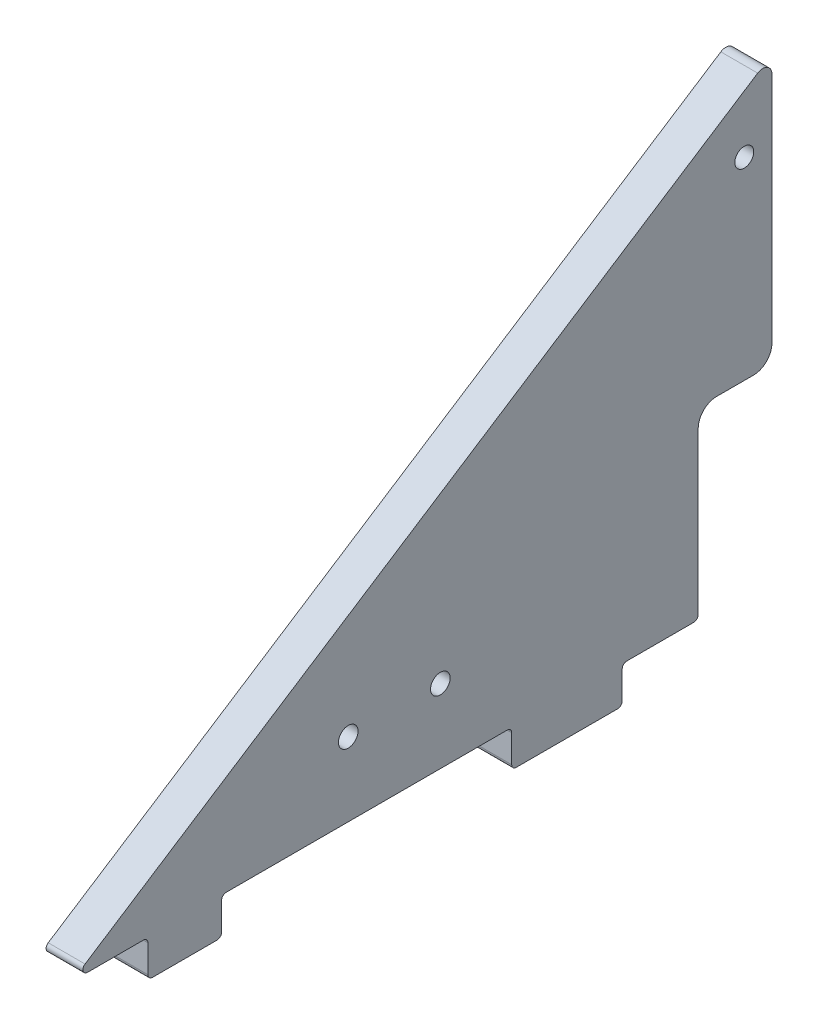
ISO-10303-21;
HEADER;
FILE_DESCRIPTION(('STEP AP214'),'2;1');
FILE_NAME('part.step','',(''),(''),'','','');
FILE_SCHEMA(('AUTOMOTIVE_DESIGN { 1 0 10303 214 1 1 1 1 }'));
ENDSEC;
DATA;
#1=APPLICATION_CONTEXT('core data for automotive mechanical design processes');
#2=APPLICATION_PROTOCOL_DEFINITION('international standard','automotive_design',2000,#1);
#3=PRODUCT_CONTEXT('',#1,'mechanical');
#4=PRODUCT('Part','Part','',(#3));
#5=PRODUCT_RELATED_PRODUCT_CATEGORY('part','',(#4));
#6=PRODUCT_DEFINITION_FORMATION('','',#4);
#7=PRODUCT_DEFINITION_CONTEXT('part definition',#1,'design');
#8=PRODUCT_DEFINITION('design','',#6,#7);
#9=PRODUCT_DEFINITION_SHAPE('','',#8);
#10=(LENGTH_UNIT() NAMED_UNIT(*) SI_UNIT(.MILLI.,.METRE.));
#11=(NAMED_UNIT(*) PLANE_ANGLE_UNIT() SI_UNIT($,.RADIAN.));
#12=(NAMED_UNIT(*) SI_UNIT($,.STERADIAN.) SOLID_ANGLE_UNIT());
#13=UNCERTAINTY_MEASURE_WITH_UNIT(LENGTH_MEASURE(1.E-05),#10,'distance_accuracy_value','');
#14=(GEOMETRIC_REPRESENTATION_CONTEXT(3) GLOBAL_UNCERTAINTY_ASSIGNED_CONTEXT((#13)) GLOBAL_UNIT_ASSIGNED_CONTEXT((#10,
#11,#12)) REPRESENTATION_CONTEXT('',''));
#15=CARTESIAN_POINT('',(0.,0.,0.));
#16=DIRECTION('',(0.,0.,1.));
#17=DIRECTION('',(1.,0.,0.));
#18=AXIS2_PLACEMENT_3D('',#15,#16,#17);
#19=CARTESIAN_POINT('',(6.35,0.,0.));
#20=DIRECTION('',(0.,0.,-1.));
#21=DIRECTION('',(0.,1.,0.));
#22=AXIS2_PLACEMENT_3D('',#19,#20,#21);
#23=PLANE('',#22);
#24=DIRECTION('',(0.,-1.,0.));
#25=VECTOR('',#24,1.);
#26=CARTESIAN_POINT('',(-6.35,0.,0.));
#27=LINE('',#26,#25);
#28=CARTESIAN_POINT('',(-6.35,57.15,0.));
#29=VERTEX_POINT('',#28);
#30=CARTESIAN_POINT('',(-6.35,1.5875,0.));
#31=VERTEX_POINT('',#30);
#32=EDGE_CURVE('E231',#29,#31,#27,.T.);
#33=ORIENTED_EDGE('',*,*,#32,.F.);
#34=DIRECTION('',(-1.,0.,0.));
#35=VECTOR('',#34,1.);
#36=CARTESIAN_POINT('',(6.35,57.15,0.));
#37=LINE('',#36,#35);
#38=CARTESIAN_POINT('',(6.35,57.15,0.));
#39=VERTEX_POINT('',#38);
#40=EDGE_CURVE('E62',#29,#39,#37,.F.);
#41=ORIENTED_EDGE('',*,*,#40,.T.);
#42=DIRECTION('',(0.,-1.,0.));
#43=VECTOR('',#42,1.);
#44=CARTESIAN_POINT('',(6.35,0.,0.));
#45=LINE('',#44,#43);
#46=CARTESIAN_POINT('',(6.35,1.5875,0.));
#47=VERTEX_POINT('',#46);
#48=EDGE_CURVE('E396',#39,#47,#45,.T.);
#49=ORIENTED_EDGE('',*,*,#48,.T.);
#50=DIRECTION('',(-1.,0.,0.));
#51=VECTOR('',#50,1.);
#52=CARTESIAN_POINT('',(6.35,1.5875,0.));
#53=LINE('',#52,#51);
#54=EDGE_CURVE('E330',#47,#31,#53,.T.);
#55=ORIENTED_EDGE('',*,*,#54,.T.);
#56=EDGE_LOOP('',(#33,#41,#49,#55));
#57=FACE_BOUND('',#56,.T.);
#58=ADVANCED_FACE('F47',(#57),#23,.T.);
#59=CARTESIAN_POINT('',(6.35,98.4714634146341,63.7168292682927));
#60=DIRECTION('',(0.,0.839570157152151,0.543251278157274));
#61=DIRECTION('',(0.,-0.543251278157274,0.839570157152151));
#62=AXIS2_PLACEMENT_3D('',#59,#60,#61);
#63=PLANE('',#62);
#64=DIRECTION('',(0.,0.543251278157274,-0.839570157152151));
#65=VECTOR('',#64,1.);
#66=CARTESIAN_POINT('',(-6.35,98.4714634146341,63.7168292682927));
#67=LINE('',#66,#65);
#68=CARTESIAN_POINT('',(-6.35,2.920317624479,211.386781853078));
#69=VERTEX_POINT('',#68);
#70=CARTESIAN_POINT('',(-6.35,152.964820535903,-20.5001771918507));
#71=VERTEX_POINT('',#70);
#72=EDGE_CURVE('E219',#69,#71,#67,.T.);
#73=ORIENTED_EDGE('',*,*,#72,.F.);
#74=DIRECTION('',(-1.,0.,0.));
#75=VECTOR('',#74,1.);
#76=CARTESIAN_POINT('',(6.35,2.92031762447902,211.386781853078));
#77=LINE('',#76,#75);
#78=CARTESIAN_POINT('',(6.35,2.920317624479,211.386781853078));
#79=VERTEX_POINT('',#78);
#80=EDGE_CURVE('E275',#69,#79,#77,.F.);
#81=ORIENTED_EDGE('',*,*,#80,.T.);
#82=DIRECTION('',(0.,0.543251278157274,-0.839570157152151));
#83=VECTOR('',#82,1.);
#84=CARTESIAN_POINT('',(6.35,98.4714634146341,63.7168292682927));
#85=LINE('',#84,#83);
#86=CARTESIAN_POINT('',(6.35,152.964820535903,-20.5001771918507));
#87=VERTEX_POINT('',#86);
#88=EDGE_CURVE('E243',#79,#87,#85,.T.);
#89=ORIENTED_EDGE('',*,*,#88,.T.);
#90=DIRECTION('',(-1.,0.,0.));
#91=VECTOR('',#90,1.);
#92=CARTESIAN_POINT('',(6.35,152.964820535903,-20.5001771918507));
#93=LINE('',#92,#91);
#94=EDGE_CURVE('E238',#87,#71,#93,.T.);
#95=ORIENTED_EDGE('',*,*,#94,.T.);
#96=EDGE_LOOP('',(#73,#81,#89,#95));
#97=FACE_BOUND('',#96,.T.);
#98=ADVANCED_FACE('F241',(#97),#63,.T.);
#99=CARTESIAN_POINT('',(6.35,0.,0.));
#100=DIRECTION('',(0.,-1.,0.));
#101=DIRECTION('',(0.,0.,-1.));
#102=AXIS2_PLACEMENT_3D('',#99,#100,#101);
#103=PLANE('',#102);
#104=DIRECTION('',(0.,0.,1.));
#105=VECTOR('',#104,1.);
#106=CARTESIAN_POINT('',(6.35,0.,0.));
#107=LINE('',#106,#105);
#108=CARTESIAN_POINT('',(6.35,0.,191.29375));
#109=VERTEX_POINT('',#108);
#110=CARTESIAN_POINT('',(6.35,0.,210.524370449003));
#111=VERTEX_POINT('',#110);
#112=EDGE_CURVE('E251',#109,#111,#107,.T.);
#113=ORIENTED_EDGE('',*,*,#112,.T.);
#114=DIRECTION('',(-1.,0.,0.));
#115=VECTOR('',#114,1.);
#116=CARTESIAN_POINT('',(6.35,0.,210.524370449003));
#117=LINE('',#116,#115);
#118=CARTESIAN_POINT('',(-6.35,0.,210.524370449003));
#119=VERTEX_POINT('',#118);
#120=EDGE_CURVE('E261',#111,#119,#117,.T.);
#121=ORIENTED_EDGE('',*,*,#120,.T.);
#122=DIRECTION('',(0.,0.,1.));
#123=VECTOR('',#122,1.);
#124=CARTESIAN_POINT('',(-6.35,0.,0.));
#125=LINE('',#124,#123);
#126=CARTESIAN_POINT('',(-6.35,0.,191.29375));
#127=VERTEX_POINT('',#126);
#128=EDGE_CURVE('E230',#127,#119,#125,.T.);
#129=ORIENTED_EDGE('',*,*,#128,.F.);
#130=DIRECTION('',(-1.,0.,0.));
#131=VECTOR('',#130,1.);
#132=CARTESIAN_POINT('',(6.35,0.,191.29375));
#133=LINE('',#132,#131);
#134=EDGE_CURVE('E259',#127,#109,#133,.F.);
#135=ORIENTED_EDGE('',*,*,#134,.T.);
#136=EDGE_LOOP('',(#113,#121,#129,#135));
#137=FACE_BOUND('',#136,.T.);
#138=ADVANCED_FACE('F443',(#137),#103,.T.);
#139=CARTESIAN_POINT('',(6.35,0.,189.70625));
#140=DIRECTION('',(0.,0.,-1.));
#141=DIRECTION('',(-1.,0.,0.));
#142=AXIS2_PLACEMENT_3D('',#139,#140,#141);
#143=PLANE('',#142);
#144=DIRECTION('',(0.,-1.,0.));
#145=VECTOR('',#144,1.);
#146=CARTESIAN_POINT('',(6.35,0.,189.70625));
#147=LINE('',#146,#145);
#148=CARTESIAN_POINT('',(6.35,-1.58750000000002,189.70625));
#149=VERTEX_POINT('',#148);
#150=CARTESIAN_POINT('',(6.35,-11.1125,189.70625));
#151=VERTEX_POINT('',#150);
#152=EDGE_CURVE('E400',#149,#151,#147,.T.);
#153=ORIENTED_EDGE('',*,*,#152,.F.);
#154=DIRECTION('',(-1.,0.,0.));
#155=VECTOR('',#154,1.);
#156=CARTESIAN_POINT('',(6.35,-1.58750000000002,189.70625));
#157=LINE('',#156,#155);
#158=CARTESIAN_POINT('',(-6.35,-1.58750000000002,189.70625));
#159=VERTEX_POINT('',#158);
#160=EDGE_CURVE('E317',#149,#159,#157,.T.);
#161=ORIENTED_EDGE('',*,*,#160,.T.);
#162=DIRECTION('',(0.,-1.,0.));
#163=VECTOR('',#162,1.);
#164=CARTESIAN_POINT('',(-6.35,0.,189.70625));
#165=LINE('',#164,#163);
#166=CARTESIAN_POINT('',(-6.35,-11.1125,189.70625));
#167=VERTEX_POINT('',#166);
#168=EDGE_CURVE('E422',#159,#167,#165,.T.);
#169=ORIENTED_EDGE('',*,*,#168,.T.);
#170=DIRECTION('',(-1.,0.,0.));
#171=VECTOR('',#170,1.);
#172=CARTESIAN_POINT('',(6.35,-11.1125,189.70625));
#173=LINE('',#172,#171);
#174=EDGE_CURVE('E315',#167,#151,#173,.F.);
#175=ORIENTED_EDGE('',*,*,#174,.T.);
#176=EDGE_LOOP('',(#153,#161,#169,#175));
#177=FACE_BOUND('',#176,.T.);
#178=ADVANCED_FACE('F454',(#177),#143,.F.);
#179=CARTESIAN_POINT('',(6.35,-12.7,0.));
#180=DIRECTION('',(0.,-1.,0.));
#181=DIRECTION('',(0.,0.,-1.));
#182=AXIS2_PLACEMENT_3D('',#179,#180,#181);
#183=PLANE('',#182);
#184=DIRECTION('',(0.,0.,1.));
#185=VECTOR('',#184,1.);
#186=CARTESIAN_POINT('',(-6.35,-12.7,0.));
#187=LINE('',#186,#185);
#188=CARTESIAN_POINT('',(-6.35,-12.7,165.89375));
#189=VERTEX_POINT('',#188);
#190=CARTESIAN_POINT('',(-6.35,-12.7,188.11875));
#191=VERTEX_POINT('',#190);
#192=EDGE_CURVE('E425',#189,#191,#187,.T.);
#193=ORIENTED_EDGE('',*,*,#192,.F.);
#194=DIRECTION('',(-1.,0.,0.));
#195=VECTOR('',#194,1.);
#196=CARTESIAN_POINT('',(6.35,-12.7,165.89375));
#197=LINE('',#196,#195);
#198=CARTESIAN_POINT('',(6.35,-12.7,165.89375));
#199=VERTEX_POINT('',#198);
#200=EDGE_CURVE('E323',#189,#199,#197,.F.);
#201=ORIENTED_EDGE('',*,*,#200,.T.);
#202=DIRECTION('',(0.,0.,1.));
#203=VECTOR('',#202,1.);
#204=CARTESIAN_POINT('',(6.35,-12.7,0.));
#205=LINE('',#204,#203);
#206=CARTESIAN_POINT('',(6.35,-12.7,188.11875));
#207=VERTEX_POINT('',#206);
#208=EDGE_CURVE('E403',#199,#207,#205,.T.);
#209=ORIENTED_EDGE('',*,*,#208,.T.);
#210=DIRECTION('',(-1.,0.,0.));
#211=VECTOR('',#210,1.);
#212=CARTESIAN_POINT('',(-6.35,-12.7,188.11875));
#213=LINE('',#212,#211);
#214=EDGE_CURVE('E320',#207,#191,#213,.T.);
#215=ORIENTED_EDGE('',*,*,#214,.T.);
#216=EDGE_LOOP('',(#193,#201,#209,#215));
#217=FACE_BOUND('',#216,.T.);
#218=ADVANCED_FACE('F463',(#217),#183,.T.);
#219=CARTESIAN_POINT('',(6.35,0.,164.30625));
#220=DIRECTION('',(0.,0.,-1.));
#221=DIRECTION('',(-1.,0.,0.));
#222=AXIS2_PLACEMENT_3D('',#219,#220,#221);
#223=PLANE('',#222);
#224=DIRECTION('',(0.,-1.,0.));
#225=VECTOR('',#224,1.);
#226=CARTESIAN_POINT('',(-6.35,0.,164.30625));
#227=LINE('',#226,#225);
#228=CARTESIAN_POINT('',(-6.35,-1.58750000000002,164.30625));
#229=VERTEX_POINT('',#228);
#230=CARTESIAN_POINT('',(-6.35,-11.1125,164.30625));
#231=VERTEX_POINT('',#230);
#232=EDGE_CURVE('E421',#229,#231,#227,.T.);
#233=ORIENTED_EDGE('',*,*,#232,.F.);
#234=DIRECTION('',(-1.,0.,0.));
#235=VECTOR('',#234,1.);
#236=CARTESIAN_POINT('',(6.35,-1.58750000000002,164.30625));
#237=LINE('',#236,#235);
#238=CARTESIAN_POINT('',(6.35,-1.58750000000002,164.30625));
#239=VERTEX_POINT('',#238);
#240=EDGE_CURVE('E313',#229,#239,#237,.F.);
#241=ORIENTED_EDGE('',*,*,#240,.T.);
#242=DIRECTION('',(0.,-1.,0.));
#243=VECTOR('',#242,1.);
#244=CARTESIAN_POINT('',(6.35,0.,164.30625));
#245=LINE('',#244,#243);
#246=CARTESIAN_POINT('',(6.35,-11.1125,164.30625));
#247=VERTEX_POINT('',#246);
#248=EDGE_CURVE('E406',#239,#247,#245,.T.);
#249=ORIENTED_EDGE('',*,*,#248,.T.);
#250=DIRECTION('',(-1.,0.,0.));
#251=VECTOR('',#250,1.);
#252=CARTESIAN_POINT('',(6.35,-11.1125,164.30625));
#253=LINE('',#252,#251);
#254=EDGE_CURVE('E310',#247,#231,#253,.T.);
#255=ORIENTED_EDGE('',*,*,#254,.T.);
#256=EDGE_LOOP('',(#233,#241,#249,#255));
#257=FACE_BOUND('',#256,.T.);
#258=ADVANCED_FACE('F472',(#257),#223,.T.);
#259=CARTESIAN_POINT('',(-6.35,0.,65.88125));
#260=VERTEX_POINT('',#259);
#261=CARTESIAN_POINT('',(-6.35,0.,162.71875));
#262=VERTEX_POINT('',#261);
#263=EDGE_CURVE('E417',#260,#262,#125,.T.);
#264=ORIENTED_EDGE('',*,*,#263,.F.);
#265=DIRECTION('',(-1.,0.,0.));
#266=VECTOR('',#265,1.);
#267=CARTESIAN_POINT('',(6.35,0.,65.88125));
#268=LINE('',#267,#266);
#269=CARTESIAN_POINT('',(6.35,0.,65.88125));
#270=VERTEX_POINT('',#269);
#271=EDGE_CURVE('E298',#260,#270,#268,.F.);
#272=ORIENTED_EDGE('',*,*,#271,.T.);
#273=CARTESIAN_POINT('',(6.35,0.,162.71875));
#274=VERTEX_POINT('',#273);
#275=EDGE_CURVE('E250',#270,#274,#107,.T.);
#276=ORIENTED_EDGE('',*,*,#275,.T.);
#277=DIRECTION('',(-1.,0.,0.));
#278=VECTOR('',#277,1.);
#279=CARTESIAN_POINT('',(-6.35,0.,162.71875));
#280=LINE('',#279,#278);
#281=EDGE_CURVE('E295',#274,#262,#280,.T.);
#282=ORIENTED_EDGE('',*,*,#281,.T.);
#283=EDGE_LOOP('',(#264,#272,#276,#282));
#284=FACE_BOUND('',#283,.T.);
#285=ADVANCED_FACE('F482',(#284),#103,.T.);
#286=CARTESIAN_POINT('',(6.35,0.,64.29375));
#287=DIRECTION('',(0.,0.,-1.));
#288=DIRECTION('',(-1.,0.,0.));
#289=AXIS2_PLACEMENT_3D('',#286,#287,#288);
#290=PLANE('',#289);
#291=DIRECTION('',(0.,-1.,0.));
#292=VECTOR('',#291,1.);
#293=CARTESIAN_POINT('',(6.35,0.,64.29375));
#294=LINE('',#293,#292);
#295=CARTESIAN_POINT('',(6.35,-1.58750000000001,64.29375));
#296=VERTEX_POINT('',#295);
#297=CARTESIAN_POINT('',(6.35,-11.1125,64.29375));
#298=VERTEX_POINT('',#297);
#299=EDGE_CURVE('E409',#296,#298,#294,.T.);
#300=ORIENTED_EDGE('',*,*,#299,.F.);
#301=DIRECTION('',(-1.,0.,0.));
#302=VECTOR('',#301,1.);
#303=CARTESIAN_POINT('',(6.35,-1.58750000000001,64.29375));
#304=LINE('',#303,#302);
#305=CARTESIAN_POINT('',(-6.35,-1.58750000000001,64.29375));
#306=VERTEX_POINT('',#305);
#307=EDGE_CURVE('E292',#296,#306,#304,.T.);
#308=ORIENTED_EDGE('',*,*,#307,.T.);
#309=DIRECTION('',(0.,-1.,0.));
#310=VECTOR('',#309,1.);
#311=CARTESIAN_POINT('',(-6.35,0.,64.29375));
#312=LINE('',#311,#310);
#313=CARTESIAN_POINT('',(-6.35,-11.1125,64.29375));
#314=VERTEX_POINT('',#313);
#315=EDGE_CURVE('E420',#306,#314,#312,.T.);
#316=ORIENTED_EDGE('',*,*,#315,.T.);
#317=DIRECTION('',(-1.,0.,0.));
#318=VECTOR('',#317,1.);
#319=CARTESIAN_POINT('',(6.35,-11.1125,64.29375));
#320=LINE('',#319,#318);
#321=EDGE_CURVE('E290',#314,#298,#320,.F.);
#322=ORIENTED_EDGE('',*,*,#321,.T.);
#323=EDGE_LOOP('',(#300,#308,#316,#322));
#324=FACE_BOUND('',#323,.T.);
#325=ADVANCED_FACE('F565',(#324),#290,.F.);
#326=CARTESIAN_POINT('',(6.35,-12.7,0.));
#327=DIRECTION('',(0.,-1.,0.));
#328=DIRECTION('',(0.,0.,-1.));
#329=AXIS2_PLACEMENT_3D('',#326,#327,#328);
#330=PLANE('',#329);
#331=DIRECTION('',(0.,0.,1.));
#332=VECTOR('',#331,1.);
#333=CARTESIAN_POINT('',(6.35,-12.7,0.));
#334=LINE('',#333,#332);
#335=CARTESIAN_POINT('',(6.35,-12.7,27.78125));
#336=VERTEX_POINT('',#335);
#337=CARTESIAN_POINT('',(6.35,-12.7,62.70625));
#338=VERTEX_POINT('',#337);
#339=EDGE_CURVE('E412',#336,#338,#334,.T.);
#340=ORIENTED_EDGE('',*,*,#339,.T.);
#341=DIRECTION('',(-1.,0.,0.));
#342=VECTOR('',#341,1.);
#343=CARTESIAN_POINT('',(-6.35,-12.7,62.70625));
#344=LINE('',#343,#342);
#345=CARTESIAN_POINT('',(-6.35,-12.7,62.70625));
#346=VERTEX_POINT('',#345);
#347=EDGE_CURVE('E327',#338,#346,#344,.T.);
#348=ORIENTED_EDGE('',*,*,#347,.T.);
#349=DIRECTION('',(0.,0.,1.));
#350=VECTOR('',#349,1.);
#351=CARTESIAN_POINT('',(-6.35,-12.7,0.));
#352=LINE('',#351,#350);
#353=CARTESIAN_POINT('',(-6.35,-12.7,27.78125));
#354=VERTEX_POINT('',#353);
#355=EDGE_CURVE('E431',#354,#346,#352,.T.);
#356=ORIENTED_EDGE('',*,*,#355,.F.);
#357=DIRECTION('',(-1.,0.,0.));
#358=VECTOR('',#357,1.);
#359=CARTESIAN_POINT('',(6.35,-12.7,27.78125));
#360=LINE('',#359,#358);
#361=EDGE_CURVE('E325',#354,#336,#360,.F.);
#362=ORIENTED_EDGE('',*,*,#361,.T.);
#363=EDGE_LOOP('',(#340,#348,#356,#362));
#364=FACE_BOUND('',#363,.T.);
#365=ADVANCED_FACE('F557',(#364),#330,.T.);
#366=CARTESIAN_POINT('',(6.35,0.,26.19375));
#367=DIRECTION('',(0.,0.,-1.));
#368=DIRECTION('',(-1.,0.,0.));
#369=AXIS2_PLACEMENT_3D('',#366,#367,#368);
#370=PLANE('',#369);
#371=DIRECTION('',(0.,-1.,0.));
#372=VECTOR('',#371,1.);
#373=CARTESIAN_POINT('',(-6.35,0.,26.19375));
#374=LINE('',#373,#372);
#375=CARTESIAN_POINT('',(-6.35,-1.5875,26.19375));
#376=VERTEX_POINT('',#375);
#377=CARTESIAN_POINT('',(-6.35,-11.1125,26.19375));
#378=VERTEX_POINT('',#377);
#379=EDGE_CURVE('E253',#376,#378,#374,.T.);
#380=ORIENTED_EDGE('',*,*,#379,.F.);
#381=DIRECTION('',(-1.,0.,0.));
#382=VECTOR('',#381,1.);
#383=CARTESIAN_POINT('',(6.35,-1.5875,26.19375));
#384=LINE('',#383,#382);
#385=CARTESIAN_POINT('',(6.35,-1.5875,26.19375));
#386=VERTEX_POINT('',#385);
#387=EDGE_CURVE('E308',#376,#386,#384,.F.);
#388=ORIENTED_EDGE('',*,*,#387,.T.);
#389=DIRECTION('',(0.,-1.,0.));
#390=VECTOR('',#389,1.);
#391=CARTESIAN_POINT('',(6.35,0.,26.19375));
#392=LINE('',#391,#390);
#393=CARTESIAN_POINT('',(6.35,-11.1125,26.19375));
#394=VERTEX_POINT('',#393);
#395=EDGE_CURVE('E248',#386,#394,#392,.T.);
#396=ORIENTED_EDGE('',*,*,#395,.T.);
#397=DIRECTION('',(-1.,0.,0.));
#398=VECTOR('',#397,1.);
#399=CARTESIAN_POINT('',(6.35,-11.1125,26.19375));
#400=LINE('',#399,#398);
#401=EDGE_CURVE('E305',#394,#378,#400,.T.);
#402=ORIENTED_EDGE('',*,*,#401,.T.);
#403=EDGE_LOOP('',(#380,#388,#396,#402));
#404=FACE_BOUND('',#403,.T.);
#405=ADVANCED_FACE('F552',(#404),#370,.T.);
#406=CARTESIAN_POINT('',(6.35,0.,1.5875));
#407=VERTEX_POINT('',#406);
#408=CARTESIAN_POINT('',(6.35,0.,24.60625));
#409=VERTEX_POINT('',#408);
#410=EDGE_CURVE('E245',#407,#409,#107,.T.);
#411=ORIENTED_EDGE('',*,*,#410,.T.);
#412=DIRECTION('',(-1.,0.,0.));
#413=VECTOR('',#412,1.);
#414=CARTESIAN_POINT('',(-6.35,0.,24.60625));
#415=LINE('',#414,#413);
#416=CARTESIAN_POINT('',(-6.35,0.,24.60625));
#417=VERTEX_POINT('',#416);
#418=EDGE_CURVE('E302',#409,#417,#415,.T.);
#419=ORIENTED_EDGE('',*,*,#418,.T.);
#420=CARTESIAN_POINT('',(-6.35,0.,1.5875));
#421=VERTEX_POINT('',#420);
#422=EDGE_CURVE('E398',#421,#417,#125,.T.);
#423=ORIENTED_EDGE('',*,*,#422,.F.);
#424=DIRECTION('',(-1.,0.,0.));
#425=VECTOR('',#424,1.);
#426=CARTESIAN_POINT('',(6.35,0.,1.5875));
#427=LINE('',#426,#425);
#428=EDGE_CURVE('E300',#421,#407,#427,.F.);
#429=ORIENTED_EDGE('',*,*,#428,.T.);
#430=EDGE_LOOP('',(#411,#419,#423,#429));
#431=FACE_BOUND('',#430,.T.);
#432=ADVANCED_FACE('F549',(#431),#103,.T.);
#433=CARTESIAN_POINT('',(6.35,0.,0.));
#434=DIRECTION('',(1.,0.,0.));
#435=DIRECTION('',(0.,0.,-1.));
#436=AXIS2_PLACEMENT_3D('',#433,#434,#435);
#437=PLANE('',#436);
#438=CARTESIAN_POINT('',(6.35,130.175,-15.875));
#439=DIRECTION('',(1.,0.,0.));
#440=DIRECTION('',(0.,0.,-1.));
#441=AXIS2_PLACEMENT_3D('',#438,#439,#440);
#442=CIRCLE('',#441,3.26389999999999);
#443=CARTESIAN_POINT('',(6.35,130.175,-19.1389));
#444=VERTEX_POINT('',#443);
#445=EDGE_CURVE('E827',#444,#444,#442,.T.);
#446=ORIENTED_EDGE('',*,*,#445,.F.);
#447=EDGE_LOOP('',(#446));
#448=FACE_BOUND('',#447,.T.);
#449=CARTESIAN_POINT('',(6.35,25.4,88.9));
#450=DIRECTION('',(1.,0.,0.));
#451=DIRECTION('',(0.,0.,-1.));
#452=AXIS2_PLACEMENT_3D('',#449,#450,#451);
#453=CIRCLE('',#452,3.3782);
#454=CARTESIAN_POINT('',(6.35,25.4,85.5218));
#455=VERTEX_POINT('',#454);
#456=EDGE_CURVE('E375',#455,#455,#453,.T.);
#457=ORIENTED_EDGE('',*,*,#456,.F.);
#458=EDGE_LOOP('',(#457));
#459=FACE_BOUND('',#458,.T.);
#460=CARTESIAN_POINT('',(6.35,25.4,120.65));
#461=DIRECTION('',(1.,0.,0.));
#462=DIRECTION('',(0.,0.,-1.));
#463=AXIS2_PLACEMENT_3D('',#460,#461,#462);
#464=CIRCLE('',#463,3.3782);
#465=CARTESIAN_POINT('',(6.35,25.4,117.2718));
#466=VERTEX_POINT('',#465);
#467=EDGE_CURVE('E391',#466,#466,#464,.T.);
#468=ORIENTED_EDGE('',*,*,#467,.F.);
#469=EDGE_LOOP('',(#468));
#470=FACE_BOUND('',#469,.T.);
#471=DIRECTION('',(0.,0.,1.));
#472=VECTOR('',#471,1.);
#473=CARTESIAN_POINT('',(6.35,63.5,-25.4));
#474=LINE('',#473,#472);
#475=CARTESIAN_POINT('',(6.35,63.5,-19.05));
#476=VERTEX_POINT('',#475);
#477=CARTESIAN_POINT('',(6.35,63.5,-6.35000000000001));
#478=VERTEX_POINT('',#477);
#479=EDGE_CURVE('E373',#476,#478,#474,.T.);
#480=ORIENTED_EDGE('',*,*,#479,.F.);
#481=CARTESIAN_POINT('',(6.35,69.85,-19.05));
#482=DIRECTION('',(1.,0.,0.));
#483=DIRECTION('',(0.,0.,-1.));
#484=AXIS2_PLACEMENT_3D('',#481,#482,#483);
#485=CIRCLE('',#484,6.35);
#486=CARTESIAN_POINT('',(6.35,69.85,-25.4));
#487=VERTEX_POINT('',#486);
#488=EDGE_CURVE('E359',#476,#487,#485,.T.);
#489=ORIENTED_EDGE('',*,*,#488,.T.);
#490=DIRECTION('',(0.,-1.,0.));
#491=VECTOR('',#490,1.);
#492=CARTESIAN_POINT('',(6.35,156.135294117647,-25.4));
#493=LINE('',#492,#491);
#494=CARTESIAN_POINT('',(6.35,150.299185286945,-25.4));
#495=VERTEX_POINT('',#494);
#496=EDGE_CURVE('E376',#495,#487,#493,.T.);
#497=ORIENTED_EDGE('',*,*,#496,.F.);
#498=CARTESIAN_POINT('',(6.35,150.299185286945,-22.2250000000001));
#499=DIRECTION('',(1.,0.,0.));
#500=DIRECTION('',(0.,0.,-1.));
#501=AXIS2_PLACEMENT_3D('',#498,#499,#500);
#502=CIRCLE('',#501,3.175);
#503=EDGE_CURVE('E257',#495,#87,#502,.T.);
#504=ORIENTED_EDGE('',*,*,#503,.T.);
#505=ORIENTED_EDGE('',*,*,#88,.F.);
#506=CARTESIAN_POINT('',(6.35,1.58749999999997,210.524370449003));
#507=DIRECTION('',(1.,0.,0.));
#508=DIRECTION('',(0.,0.,-1.));
#509=AXIS2_PLACEMENT_3D('',#506,#507,#508);
#510=CIRCLE('',#509,1.5875);
#511=EDGE_CURVE('E288',#79,#111,#510,.T.);
#512=ORIENTED_EDGE('',*,*,#511,.T.);
#513=ORIENTED_EDGE('',*,*,#112,.F.);
#514=CARTESIAN_POINT('',(6.35,-1.58750000000002,191.29375));
#515=DIRECTION('',(1.,0.,0.));
#516=DIRECTION('',(0.,0.,-1.));
#517=AXIS2_PLACEMENT_3D('',#514,#515,#516);
#518=CIRCLE('',#517,1.5875);
#519=EDGE_CURVE('E347',#109,#149,#518,.F.);
#520=ORIENTED_EDGE('',*,*,#519,.T.);
#521=ORIENTED_EDGE('',*,*,#152,.T.);
#522=CARTESIAN_POINT('',(6.35,-11.1125,188.11875));
#523=DIRECTION('',(1.,0.,0.));
#524=DIRECTION('',(0.,0.,-1.));
#525=AXIS2_PLACEMENT_3D('',#522,#523,#524);
#526=CIRCLE('',#525,1.5875);
#527=EDGE_CURVE('E284',#151,#207,#526,.T.);
#528=ORIENTED_EDGE('',*,*,#527,.T.);
#529=ORIENTED_EDGE('',*,*,#208,.F.);
#530=CARTESIAN_POINT('',(6.35,-11.1125,165.89375));
#531=DIRECTION('',(1.,0.,0.));
#532=DIRECTION('',(0.,0.,-1.));
#533=AXIS2_PLACEMENT_3D('',#530,#531,#532);
#534=CIRCLE('',#533,1.5875);
#535=EDGE_CURVE('E286',#199,#247,#534,.T.);
#536=ORIENTED_EDGE('',*,*,#535,.T.);
#537=ORIENTED_EDGE('',*,*,#248,.F.);
#538=CARTESIAN_POINT('',(6.35,-1.58750000000002,162.71875));
#539=DIRECTION('',(1.,0.,0.));
#540=DIRECTION('',(0.,0.,-1.));
#541=AXIS2_PLACEMENT_3D('',#538,#539,#540);
#542=CIRCLE('',#541,1.5875);
#543=EDGE_CURVE('E343',#239,#274,#542,.F.);
#544=ORIENTED_EDGE('',*,*,#543,.T.);
#545=ORIENTED_EDGE('',*,*,#275,.F.);
#546=CARTESIAN_POINT('',(6.35,-1.58750000000001,65.88125));
#547=DIRECTION('',(1.,0.,0.));
#548=DIRECTION('',(0.,0.,-1.));
#549=AXIS2_PLACEMENT_3D('',#546,#547,#548);
#550=CIRCLE('',#549,1.5875);
#551=EDGE_CURVE('E335',#270,#296,#550,.F.);
#552=ORIENTED_EDGE('',*,*,#551,.T.);
#553=ORIENTED_EDGE('',*,*,#299,.T.);
#554=CARTESIAN_POINT('',(6.35,-11.1125,62.70625));
#555=DIRECTION('',(1.,0.,0.));
#556=DIRECTION('',(0.,0.,-1.));
#557=AXIS2_PLACEMENT_3D('',#554,#555,#556);
#558=CIRCLE('',#557,1.5875);
#559=EDGE_CURVE('E282',#298,#338,#558,.T.);
#560=ORIENTED_EDGE('',*,*,#559,.T.);
#561=ORIENTED_EDGE('',*,*,#339,.F.);
#562=CARTESIAN_POINT('',(6.35,-11.1125,27.78125));
#563=DIRECTION('',(1.,0.,0.));
#564=DIRECTION('',(0.,0.,-1.));
#565=AXIS2_PLACEMENT_3D('',#562,#563,#564);
#566=CIRCLE('',#565,1.5875);
#567=EDGE_CURVE('E280',#336,#394,#566,.T.);
#568=ORIENTED_EDGE('',*,*,#567,.T.);
#569=ORIENTED_EDGE('',*,*,#395,.F.);
#570=CARTESIAN_POINT('',(6.35,-1.5875,24.60625));
#571=DIRECTION('',(1.,0.,0.));
#572=DIRECTION('',(0.,0.,-1.));
#573=AXIS2_PLACEMENT_3D('',#570,#571,#572);
#574=CIRCLE('',#573,1.5875);
#575=EDGE_CURVE('E339',#386,#409,#574,.F.);
#576=ORIENTED_EDGE('',*,*,#575,.T.);
#577=ORIENTED_EDGE('',*,*,#410,.F.);
#578=CARTESIAN_POINT('',(6.35,1.5875,1.5875));
#579=DIRECTION('',(1.,0.,0.));
#580=DIRECTION('',(0.,0.,-1.));
#581=AXIS2_PLACEMENT_3D('',#578,#579,#580);
#582=CIRCLE('',#581,1.5875);
#583=EDGE_CURVE('E277',#407,#47,#582,.T.);
#584=ORIENTED_EDGE('',*,*,#583,.T.);
#585=ORIENTED_EDGE('',*,*,#48,.F.);
#586=CARTESIAN_POINT('',(6.35,57.15,-6.35));
#587=DIRECTION('',(1.,0.,0.));
#588=DIRECTION('',(0.,0.,-1.));
#589=AXIS2_PLACEMENT_3D('',#586,#587,#588);
#590=CIRCLE('',#589,6.35);
#591=EDGE_CURVE('E13',#39,#478,#590,.F.);
#592=ORIENTED_EDGE('',*,*,#591,.T.);
#593=EDGE_LOOP('',(#480,#489,#497,#504,#505,#512,#513,#520,#521,#528,#529,#536,#537,#544,#545,
#552,#553,#560,#561,#568,#569,#576,#577,#584,#585,#592));
#594=FACE_BOUND('',#593,.T.);
#595=ADVANCED_FACE('F451',(#448,#459,#470,#594),#437,.T.);
#596=CARTESIAN_POINT('',(-6.35,0.,0.));
#597=DIRECTION('',(1.,0.,0.));
#598=DIRECTION('',(0.,0.,-1.));
#599=AXIS2_PLACEMENT_3D('',#596,#597,#598);
#600=PLANE('',#599);
#601=CARTESIAN_POINT('',(-6.35,130.175,-15.875));
#602=DIRECTION('',(1.,0.,0.));
#603=DIRECTION('',(0.,0.,-1.));
#604=AXIS2_PLACEMENT_3D('',#601,#602,#603);
#605=CIRCLE('',#604,3.26389999999999);
#606=CARTESIAN_POINT('',(-6.35,130.175,-19.1389));
#607=VERTEX_POINT('',#606);
#608=EDGE_CURVE('E387',#607,#607,#605,.T.);
#609=ORIENTED_EDGE('',*,*,#608,.T.);
#610=EDGE_LOOP('',(#609));
#611=FACE_BOUND('',#610,.T.);
#612=CARTESIAN_POINT('',(-6.35,25.4,88.9));
#613=DIRECTION('',(1.,0.,0.));
#614=DIRECTION('',(0.,0.,-1.));
#615=AXIS2_PLACEMENT_3D('',#612,#613,#614);
#616=CIRCLE('',#615,3.3782);
#617=CARTESIAN_POINT('',(-6.35,25.4,85.5218));
#618=VERTEX_POINT('',#617);
#619=EDGE_CURVE('E379',#618,#618,#616,.T.);
#620=ORIENTED_EDGE('',*,*,#619,.T.);
#621=EDGE_LOOP('',(#620));
#622=FACE_BOUND('',#621,.T.);
#623=CARTESIAN_POINT('',(-6.35,25.4,120.65));
#624=DIRECTION('',(1.,0.,0.));
#625=DIRECTION('',(0.,0.,-1.));
#626=AXIS2_PLACEMENT_3D('',#623,#624,#625);
#627=CIRCLE('',#626,3.3782);
#628=CARTESIAN_POINT('',(-6.35,25.4,117.2718));
#629=VERTEX_POINT('',#628);
#630=EDGE_CURVE('E368',#629,#629,#627,.T.);
#631=ORIENTED_EDGE('',*,*,#630,.T.);
#632=EDGE_LOOP('',(#631));
#633=FACE_BOUND('',#632,.T.);
#634=DIRECTION('',(0.,-1.,0.));
#635=VECTOR('',#634,1.);
#636=CARTESIAN_POINT('',(-6.35,156.135294117647,-25.4));
#637=LINE('',#636,#635);
#638=CARTESIAN_POINT('',(-6.35,150.299185286945,-25.4));
#639=VERTEX_POINT('',#638);
#640=CARTESIAN_POINT('',(-6.35,69.85,-25.4));
#641=VERTEX_POINT('',#640);
#642=EDGE_CURVE('E385',#639,#641,#637,.T.);
#643=ORIENTED_EDGE('',*,*,#642,.T.);
#644=CARTESIAN_POINT('',(-6.35,69.85,-19.05));
#645=DIRECTION('',(1.,0.,0.));
#646=DIRECTION('',(0.,0.,-1.));
#647=AXIS2_PLACEMENT_3D('',#644,#645,#646);
#648=CIRCLE('',#647,6.35);
#649=CARTESIAN_POINT('',(-6.35,63.5,-19.05));
#650=VERTEX_POINT('',#649);
#651=EDGE_CURVE('E352',#641,#650,#648,.F.);
#652=ORIENTED_EDGE('',*,*,#651,.T.);
#653=DIRECTION('',(0.,0.,1.));
#654=VECTOR('',#653,1.);
#655=CARTESIAN_POINT('',(-6.35,63.5,-25.4));
#656=LINE('',#655,#654);
#657=CARTESIAN_POINT('',(-6.35,63.5,-6.35000000000001));
#658=VERTEX_POINT('',#657);
#659=EDGE_CURVE('E364',#650,#658,#656,.T.);
#660=ORIENTED_EDGE('',*,*,#659,.T.);
#661=CARTESIAN_POINT('',(-6.35,57.15,-6.35));
#662=DIRECTION('',(1.,0.,0.));
#663=DIRECTION('',(0.,0.,-1.));
#664=AXIS2_PLACEMENT_3D('',#661,#662,#663);
#665=CIRCLE('',#664,6.35);
#666=EDGE_CURVE('E55',#658,#29,#665,.T.);
#667=ORIENTED_EDGE('',*,*,#666,.T.);
#668=ORIENTED_EDGE('',*,*,#32,.T.);
#669=CARTESIAN_POINT('',(-6.35,1.5875,1.5875));
#670=DIRECTION('',(1.,0.,0.));
#671=DIRECTION('',(0.,0.,-1.));
#672=AXIS2_PLACEMENT_3D('',#669,#670,#671);
#673=CIRCLE('',#672,1.5875);
#674=EDGE_CURVE('E264',#31,#421,#673,.F.);
#675=ORIENTED_EDGE('',*,*,#674,.T.);
#676=ORIENTED_EDGE('',*,*,#422,.T.);
#677=CARTESIAN_POINT('',(-6.35,-1.5875,24.60625));
#678=DIRECTION('',(1.,0.,0.));
#679=DIRECTION('',(0.,0.,-1.));
#680=AXIS2_PLACEMENT_3D('',#677,#678,#679);
#681=CIRCLE('',#680,1.5875);
#682=EDGE_CURVE('E337',#417,#376,#681,.T.);
#683=ORIENTED_EDGE('',*,*,#682,.T.);
#684=ORIENTED_EDGE('',*,*,#379,.T.);
#685=CARTESIAN_POINT('',(-6.35,-11.1125,27.78125));
#686=DIRECTION('',(1.,0.,0.));
#687=DIRECTION('',(0.,0.,-1.));
#688=AXIS2_PLACEMENT_3D('',#685,#686,#687);
#689=CIRCLE('',#688,1.5875);
#690=EDGE_CURVE('E266',#378,#354,#689,.F.);
#691=ORIENTED_EDGE('',*,*,#690,.T.);
#692=ORIENTED_EDGE('',*,*,#355,.T.);
#693=CARTESIAN_POINT('',(-6.35,-11.1125,62.70625));
#694=DIRECTION('',(1.,0.,0.));
#695=DIRECTION('',(0.,0.,-1.));
#696=AXIS2_PLACEMENT_3D('',#693,#694,#695);
#697=CIRCLE('',#696,1.5875);
#698=EDGE_CURVE('E268',#346,#314,#697,.F.);
#699=ORIENTED_EDGE('',*,*,#698,.T.);
#700=ORIENTED_EDGE('',*,*,#315,.F.);
#701=CARTESIAN_POINT('',(-6.35,-1.58750000000001,65.88125));
#702=DIRECTION('',(1.,0.,0.));
#703=DIRECTION('',(0.,0.,-1.));
#704=AXIS2_PLACEMENT_3D('',#701,#702,#703);
#705=CIRCLE('',#704,1.5875);
#706=EDGE_CURVE('E333',#306,#260,#705,.T.);
#707=ORIENTED_EDGE('',*,*,#706,.T.);
#708=ORIENTED_EDGE('',*,*,#263,.T.);
#709=CARTESIAN_POINT('',(-6.35,-1.58750000000002,162.71875));
#710=DIRECTION('',(1.,0.,0.));
#711=DIRECTION('',(0.,0.,-1.));
#712=AXIS2_PLACEMENT_3D('',#709,#710,#711);
#713=CIRCLE('',#712,1.5875);
#714=EDGE_CURVE('E341',#262,#229,#713,.T.);
#715=ORIENTED_EDGE('',*,*,#714,.T.);
#716=ORIENTED_EDGE('',*,*,#232,.T.);
#717=CARTESIAN_POINT('',(-6.35,-11.1125,165.89375));
#718=DIRECTION('',(1.,0.,0.));
#719=DIRECTION('',(0.,0.,-1.));
#720=AXIS2_PLACEMENT_3D('',#717,#718,#719);
#721=CIRCLE('',#720,1.5875);
#722=EDGE_CURVE('E272',#231,#189,#721,.F.);
#723=ORIENTED_EDGE('',*,*,#722,.T.);
#724=ORIENTED_EDGE('',*,*,#192,.T.);
#725=CARTESIAN_POINT('',(-6.35,-11.1125,188.11875));
#726=DIRECTION('',(1.,0.,0.));
#727=DIRECTION('',(0.,0.,-1.));
#728=AXIS2_PLACEMENT_3D('',#725,#726,#727);
#729=CIRCLE('',#728,1.5875);
#730=EDGE_CURVE('E270',#191,#167,#729,.F.);
#731=ORIENTED_EDGE('',*,*,#730,.T.);
#732=ORIENTED_EDGE('',*,*,#168,.F.);
#733=CARTESIAN_POINT('',(-6.35,-1.58750000000002,191.29375));
#734=DIRECTION('',(1.,0.,0.));
#735=DIRECTION('',(0.,0.,-1.));
#736=AXIS2_PLACEMENT_3D('',#733,#734,#735);
#737=CIRCLE('',#736,1.5875);
#738=EDGE_CURVE('E345',#159,#127,#737,.T.);
#739=ORIENTED_EDGE('',*,*,#738,.T.);
#740=ORIENTED_EDGE('',*,*,#128,.T.);
#741=CARTESIAN_POINT('',(-6.35,1.58749999999997,210.524370449003));
#742=DIRECTION('',(1.,0.,0.));
#743=DIRECTION('',(0.,0.,-1.));
#744=AXIS2_PLACEMENT_3D('',#741,#742,#743);
#745=CIRCLE('',#744,1.5875);
#746=EDGE_CURVE('E226',#119,#69,#745,.F.);
#747=ORIENTED_EDGE('',*,*,#746,.T.);
#748=ORIENTED_EDGE('',*,*,#72,.T.);
#749=CARTESIAN_POINT('',(-6.35,150.299185286945,-22.2250000000001));
#750=DIRECTION('',(1.,0.,0.));
#751=DIRECTION('',(0.,0.,-1.));
#752=AXIS2_PLACEMENT_3D('',#749,#750,#751);
#753=CIRCLE('',#752,3.175);
#754=EDGE_CURVE('E223',#71,#639,#753,.F.);
#755=ORIENTED_EDGE('',*,*,#754,.T.);
#756=EDGE_LOOP('',(#643,#652,#660,#667,#668,#675,#676,#683,#684,#691,#692,#699,#700,#707,#708,
#715,#716,#723,#724,#731,#732,#739,#740,#747,#748,#755));
#757=FACE_BOUND('',#756,.T.);
#758=ADVANCED_FACE('F222',(#611,#622,#633,#757),#600,.F.);
#759=CARTESIAN_POINT('',(6.35,25.4,120.65));
#760=DIRECTION('',(1.,0.,0.));
#761=DIRECTION('',(0.,0.,-1.));
#762=AXIS2_PLACEMENT_3D('',#759,#760,#761);
#763=CYLINDRICAL_SURFACE('',#762,3.3782);
#764=ORIENTED_EDGE('',*,*,#630,.F.);
#765=EDGE_LOOP('',(#764));
#766=FACE_BOUND('',#765,.T.);
#767=ORIENTED_EDGE('',*,*,#467,.T.);
#768=EDGE_LOOP('',(#767));
#769=FACE_BOUND('',#768,.T.);
#770=ADVANCED_FACE('F660',(#766,#769),#763,.F.);
#771=CARTESIAN_POINT('',(6.35,25.4,88.9));
#772=DIRECTION('',(1.,0.,0.));
#773=DIRECTION('',(0.,0.,-1.));
#774=AXIS2_PLACEMENT_3D('',#771,#772,#773);
#775=CYLINDRICAL_SURFACE('',#774,3.3782);
#776=ORIENTED_EDGE('',*,*,#619,.F.);
#777=EDGE_LOOP('',(#776));
#778=FACE_BOUND('',#777,.T.);
#779=ORIENTED_EDGE('',*,*,#456,.T.);
#780=EDGE_LOOP('',(#779));
#781=FACE_BOUND('',#780,.T.);
#782=ADVANCED_FACE('F656',(#778,#781),#775,.F.);
#783=CARTESIAN_POINT('',(6.35,156.135294117647,-25.4));
#784=DIRECTION('',(0.,0.,-1.));
#785=DIRECTION('',(0.,1.,0.));
#786=AXIS2_PLACEMENT_3D('',#783,#784,#785);
#787=PLANE('',#786);
#788=ORIENTED_EDGE('',*,*,#496,.T.);
#789=DIRECTION('',(-1.,0.,0.));
#790=VECTOR('',#789,1.);
#791=CARTESIAN_POINT('',(6.35,69.85,-25.4));
#792=LINE('',#791,#790);
#793=EDGE_CURVE('E349',#487,#641,#792,.T.);
#794=ORIENTED_EDGE('',*,*,#793,.T.);
#795=ORIENTED_EDGE('',*,*,#642,.F.);
#796=DIRECTION('',(-1.,0.,0.));
#797=VECTOR('',#796,1.);
#798=CARTESIAN_POINT('',(6.35,150.299185286945,-25.4));
#799=LINE('',#798,#797);
#800=EDGE_CURVE('E239',#639,#495,#799,.F.);
#801=ORIENTED_EDGE('',*,*,#800,.T.);
#802=EDGE_LOOP('',(#788,#794,#795,#801));
#803=FACE_BOUND('',#802,.T.);
#804=ADVANCED_FACE('F490',(#803),#787,.T.);
#805=CARTESIAN_POINT('',(6.35,63.5,-25.4));
#806=DIRECTION('',(0.,-1.,0.));
#807=DIRECTION('',(0.,0.,-1.));
#808=AXIS2_PLACEMENT_3D('',#805,#806,#807);
#809=PLANE('',#808);
#810=ORIENTED_EDGE('',*,*,#659,.F.);
#811=DIRECTION('',(-1.,0.,0.));
#812=VECTOR('',#811,1.);
#813=CARTESIAN_POINT('',(6.35,63.5,-19.05));
#814=LINE('',#813,#812);
#815=EDGE_CURVE('E357',#650,#476,#814,.F.);
#816=ORIENTED_EDGE('',*,*,#815,.T.);
#817=ORIENTED_EDGE('',*,*,#479,.T.);
#818=DIRECTION('',(-1.,0.,0.));
#819=VECTOR('',#818,1.);
#820=CARTESIAN_POINT('',(-6.35,63.5,-6.35));
#821=LINE('',#820,#819);
#822=EDGE_CURVE('E354',#478,#658,#821,.T.);
#823=ORIENTED_EDGE('',*,*,#822,.T.);
#824=EDGE_LOOP('',(#810,#816,#817,#823));
#825=FACE_BOUND('',#824,.T.);
#826=ADVANCED_FACE('F371',(#825),#809,.T.);
#827=CARTESIAN_POINT('',(6.35,150.299185286945,-22.2250000000001));
#828=DIRECTION('',(-1.,0.,0.));
#829=DIRECTION('',(0.,0.,1.));
#830=AXIS2_PLACEMENT_3D('',#827,#828,#829);
#831=CYLINDRICAL_SURFACE('',#830,3.175);
#832=ORIENTED_EDGE('',*,*,#503,.F.);
#833=ORIENTED_EDGE('',*,*,#800,.F.);
#834=ORIENTED_EDGE('',*,*,#754,.F.);
#835=ORIENTED_EDGE('',*,*,#94,.F.);
#836=EDGE_LOOP('',(#832,#833,#834,#835));
#837=FACE_BOUND('',#836,.T.);
#838=ADVANCED_FACE('F237',(#837),#831,.T.);
#839=CARTESIAN_POINT('',(6.35,1.58749999999997,210.524370449003));
#840=DIRECTION('',(-1.,0.,0.));
#841=DIRECTION('',(0.,0.,1.));
#842=AXIS2_PLACEMENT_3D('',#839,#840,#841);
#843=CYLINDRICAL_SURFACE('',#842,1.5875);
#844=ORIENTED_EDGE('',*,*,#511,.F.);
#845=ORIENTED_EDGE('',*,*,#80,.F.);
#846=ORIENTED_EDGE('',*,*,#746,.F.);
#847=ORIENTED_EDGE('',*,*,#120,.F.);
#848=EDGE_LOOP('',(#844,#845,#846,#847));
#849=FACE_BOUND('',#848,.T.);
#850=ADVANCED_FACE('F486',(#849),#843,.T.);
#851=CARTESIAN_POINT('',(6.35,-1.58750000000001,65.88125));
#852=DIRECTION('',(-1.,0.,0.));
#853=DIRECTION('',(0.,0.,1.));
#854=AXIS2_PLACEMENT_3D('',#851,#852,#853);
#855=CYLINDRICAL_SURFACE('',#854,1.5875);
#856=ORIENTED_EDGE('',*,*,#551,.F.);
#857=ORIENTED_EDGE('',*,*,#271,.F.);
#858=ORIENTED_EDGE('',*,*,#706,.F.);
#859=ORIENTED_EDGE('',*,*,#307,.F.);
#860=EDGE_LOOP('',(#856,#857,#858,#859));
#861=FACE_BOUND('',#860,.T.);
#862=ADVANCED_FACE('F515',(#861),#855,.F.);
#863=CARTESIAN_POINT('',(6.35,-1.5875,24.60625));
#864=DIRECTION('',(1.,0.,0.));
#865=DIRECTION('',(0.,0.,-1.));
#866=AXIS2_PLACEMENT_3D('',#863,#864,#865);
#867=CYLINDRICAL_SURFACE('',#866,1.5875);
#868=ORIENTED_EDGE('',*,*,#575,.F.);
#869=ORIENTED_EDGE('',*,*,#387,.F.);
#870=ORIENTED_EDGE('',*,*,#682,.F.);
#871=ORIENTED_EDGE('',*,*,#418,.F.);
#872=EDGE_LOOP('',(#868,#869,#870,#871));
#873=FACE_BOUND('',#872,.T.);
#874=ADVANCED_FACE('F518',(#873),#867,.F.);
#875=CARTESIAN_POINT('',(6.35,-1.58750000000002,162.71875));
#876=DIRECTION('',(1.,0.,0.));
#877=DIRECTION('',(0.,0.,-1.));
#878=AXIS2_PLACEMENT_3D('',#875,#876,#877);
#879=CYLINDRICAL_SURFACE('',#878,1.5875);
#880=ORIENTED_EDGE('',*,*,#543,.F.);
#881=ORIENTED_EDGE('',*,*,#240,.F.);
#882=ORIENTED_EDGE('',*,*,#714,.F.);
#883=ORIENTED_EDGE('',*,*,#281,.F.);
#884=EDGE_LOOP('',(#880,#881,#882,#883));
#885=FACE_BOUND('',#884,.T.);
#886=ADVANCED_FACE('F475',(#885),#879,.F.);
#887=CARTESIAN_POINT('',(6.35,-1.58750000000002,191.29375));
#888=DIRECTION('',(-1.,0.,0.));
#889=DIRECTION('',(0.,0.,1.));
#890=AXIS2_PLACEMENT_3D('',#887,#888,#889);
#891=CYLINDRICAL_SURFACE('',#890,1.5875);
#892=ORIENTED_EDGE('',*,*,#519,.F.);
#893=ORIENTED_EDGE('',*,*,#134,.F.);
#894=ORIENTED_EDGE('',*,*,#738,.F.);
#895=ORIENTED_EDGE('',*,*,#160,.F.);
#896=EDGE_LOOP('',(#892,#893,#894,#895));
#897=FACE_BOUND('',#896,.T.);
#898=ADVANCED_FACE('F448',(#897),#891,.F.);
#899=CARTESIAN_POINT('',(6.35,-11.1125,165.89375));
#900=DIRECTION('',(-1.,0.,0.));
#901=DIRECTION('',(0.,0.,1.));
#902=AXIS2_PLACEMENT_3D('',#899,#900,#901);
#903=CYLINDRICAL_SURFACE('',#902,1.5875);
#904=ORIENTED_EDGE('',*,*,#535,.F.);
#905=ORIENTED_EDGE('',*,*,#200,.F.);
#906=ORIENTED_EDGE('',*,*,#722,.F.);
#907=ORIENTED_EDGE('',*,*,#254,.F.);
#908=EDGE_LOOP('',(#904,#905,#906,#907));
#909=FACE_BOUND('',#908,.T.);
#910=ADVANCED_FACE('F466',(#909),#903,.T.);
#911=CARTESIAN_POINT('',(6.35,-11.1125,188.11875));
#912=DIRECTION('',(1.,0.,0.));
#913=DIRECTION('',(0.,0.,-1.));
#914=AXIS2_PLACEMENT_3D('',#911,#912,#913);
#915=CYLINDRICAL_SURFACE('',#914,1.5875);
#916=ORIENTED_EDGE('',*,*,#527,.F.);
#917=ORIENTED_EDGE('',*,*,#174,.F.);
#918=ORIENTED_EDGE('',*,*,#730,.F.);
#919=ORIENTED_EDGE('',*,*,#214,.F.);
#920=EDGE_LOOP('',(#916,#917,#918,#919));
#921=FACE_BOUND('',#920,.T.);
#922=ADVANCED_FACE('F457',(#921),#915,.T.);
#923=CARTESIAN_POINT('',(6.35,-11.1125,62.70625));
#924=DIRECTION('',(1.,0.,0.));
#925=DIRECTION('',(0.,0.,-1.));
#926=AXIS2_PLACEMENT_3D('',#923,#924,#925);
#927=CYLINDRICAL_SURFACE('',#926,1.5875);
#928=ORIENTED_EDGE('',*,*,#559,.F.);
#929=ORIENTED_EDGE('',*,*,#321,.F.);
#930=ORIENTED_EDGE('',*,*,#698,.F.);
#931=ORIENTED_EDGE('',*,*,#347,.F.);
#932=EDGE_LOOP('',(#928,#929,#930,#931));
#933=FACE_BOUND('',#932,.T.);
#934=ADVANCED_FACE('F531',(#933),#927,.T.);
#935=CARTESIAN_POINT('',(6.35,-11.1125,27.78125));
#936=DIRECTION('',(-1.,0.,0.));
#937=DIRECTION('',(0.,0.,1.));
#938=AXIS2_PLACEMENT_3D('',#935,#936,#937);
#939=CYLINDRICAL_SURFACE('',#938,1.5875);
#940=ORIENTED_EDGE('',*,*,#567,.F.);
#941=ORIENTED_EDGE('',*,*,#361,.F.);
#942=ORIENTED_EDGE('',*,*,#690,.F.);
#943=ORIENTED_EDGE('',*,*,#401,.F.);
#944=EDGE_LOOP('',(#940,#941,#942,#943));
#945=FACE_BOUND('',#944,.T.);
#946=ADVANCED_FACE('F534',(#945),#939,.T.);
#947=CARTESIAN_POINT('',(6.35,1.5875,1.5875));
#948=DIRECTION('',(-1.,0.,0.));
#949=DIRECTION('',(0.,0.,1.));
#950=AXIS2_PLACEMENT_3D('',#947,#948,#949);
#951=CYLINDRICAL_SURFACE('',#950,1.5875);
#952=ORIENTED_EDGE('',*,*,#583,.F.);
#953=ORIENTED_EDGE('',*,*,#428,.F.);
#954=ORIENTED_EDGE('',*,*,#674,.F.);
#955=ORIENTED_EDGE('',*,*,#54,.F.);
#956=EDGE_LOOP('',(#952,#953,#954,#955));
#957=FACE_BOUND('',#956,.T.);
#958=ADVANCED_FACE('F499',(#957),#951,.T.);
#959=CARTESIAN_POINT('',(6.35,130.175,-15.875));
#960=DIRECTION('',(1.,0.,0.));
#961=DIRECTION('',(0.,0.,-1.));
#962=AXIS2_PLACEMENT_3D('',#959,#960,#961);
#963=CYLINDRICAL_SURFACE('',#962,3.26389999999999);
#964=ORIENTED_EDGE('',*,*,#608,.F.);
#965=EDGE_LOOP('',(#964));
#966=FACE_BOUND('',#965,.T.);
#967=ORIENTED_EDGE('',*,*,#445,.T.);
#968=EDGE_LOOP('',(#967));
#969=FACE_BOUND('',#968,.T.);
#970=ADVANCED_FACE('F494',(#966,#969),#963,.F.);
#971=CARTESIAN_POINT('',(6.35,69.85,-19.05));
#972=DIRECTION('',(-1.,0.,0.));
#973=DIRECTION('',(0.,0.,1.));
#974=AXIS2_PLACEMENT_3D('',#971,#972,#973);
#975=CYLINDRICAL_SURFACE('',#974,6.35);
#976=ORIENTED_EDGE('',*,*,#488,.F.);
#977=ORIENTED_EDGE('',*,*,#815,.F.);
#978=ORIENTED_EDGE('',*,*,#651,.F.);
#979=ORIENTED_EDGE('',*,*,#793,.F.);
#980=EDGE_LOOP('',(#976,#977,#978,#979));
#981=FACE_BOUND('',#980,.T.);
#982=ADVANCED_FACE('F492',(#981),#975,.T.);
#983=CARTESIAN_POINT('',(6.35,57.15,-6.35));
#984=DIRECTION('',(1.,0.,0.));
#985=DIRECTION('',(0.,0.,-1.));
#986=AXIS2_PLACEMENT_3D('',#983,#984,#985);
#987=CYLINDRICAL_SURFACE('',#986,6.35);
#988=ORIENTED_EDGE('',*,*,#591,.F.);
#989=ORIENTED_EDGE('',*,*,#40,.F.);
#990=ORIENTED_EDGE('',*,*,#666,.F.);
#991=ORIENTED_EDGE('',*,*,#822,.F.);
#992=EDGE_LOOP('',(#988,#989,#990,#991));
#993=FACE_BOUND('',#992,.T.);
#994=ADVANCED_FACE('F49',(#993),#987,.F.);
#995=CLOSED_SHELL('',(#58,#98,#138,#178,#218,#258,#285,#325,#365,#405,#432,#595,#758,#770,#782,
#804,#826,#838,#850,#862,#874,#886,#898,#910,#922,#934,#946,#958,#970,#982,#994));
#996=MANIFOLD_SOLID_BREP('B2',#995);
#997=ADVANCED_BREP_SHAPE_REPRESENTATION('',(#18,#996),#14);
#998=SHAPE_DEFINITION_REPRESENTATION(#9,#997);
ENDSEC;
END-ISO-10303-21;
